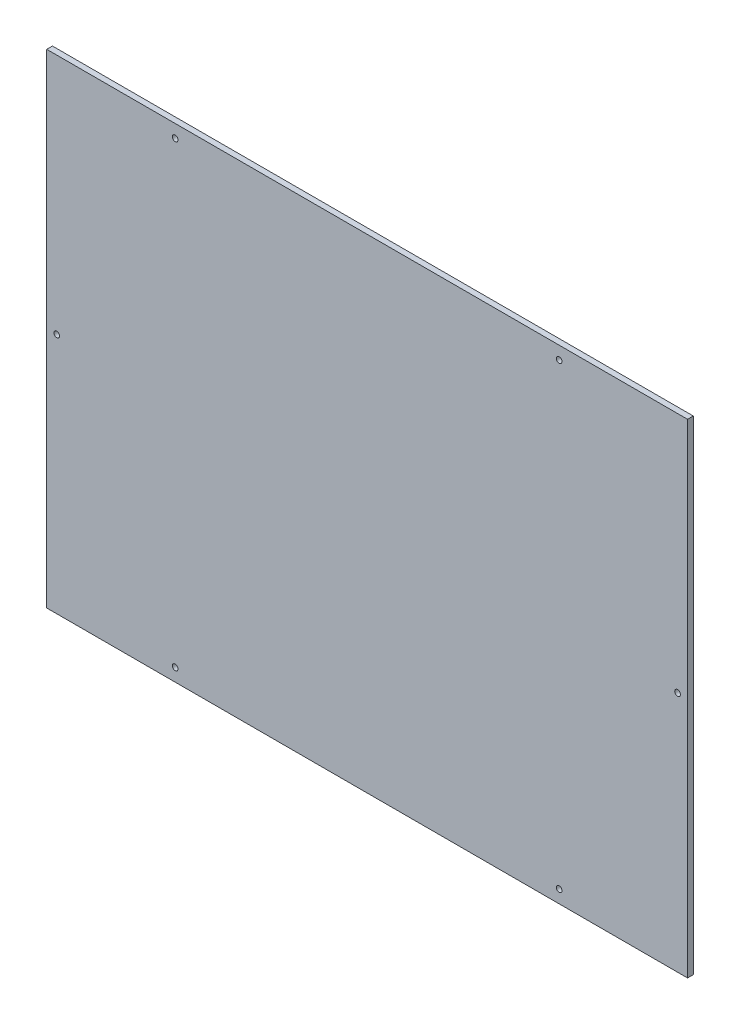
ISO-10303-21;
HEADER;
FILE_DESCRIPTION(('STEP AP214'),'2;1');
FILE_NAME('part.step','',(''),(''),'','','');
FILE_SCHEMA(('AUTOMOTIVE_DESIGN { 1 0 10303 214 1 1 1 1 }'));
ENDSEC;
DATA;
#1=APPLICATION_CONTEXT('core data for automotive mechanical design processes');
#2=APPLICATION_PROTOCOL_DEFINITION('international standard','automotive_design',2000,#1);
#3=PRODUCT_CONTEXT('',#1,'mechanical');
#4=PRODUCT('Part','Part','',(#3));
#5=PRODUCT_RELATED_PRODUCT_CATEGORY('part','',(#4));
#6=PRODUCT_DEFINITION_FORMATION('','',#4);
#7=PRODUCT_DEFINITION_CONTEXT('part definition',#1,'design');
#8=PRODUCT_DEFINITION('design','',#6,#7);
#9=PRODUCT_DEFINITION_SHAPE('','',#8);
#10=(LENGTH_UNIT() NAMED_UNIT(*) SI_UNIT(.MILLI.,.METRE.));
#11=(NAMED_UNIT(*) PLANE_ANGLE_UNIT() SI_UNIT($,.RADIAN.));
#12=(NAMED_UNIT(*) SI_UNIT($,.STERADIAN.) SOLID_ANGLE_UNIT());
#13=UNCERTAINTY_MEASURE_WITH_UNIT(LENGTH_MEASURE(1.E-05),#10,'distance_accuracy_value','');
#14=(GEOMETRIC_REPRESENTATION_CONTEXT(3) GLOBAL_UNCERTAINTY_ASSIGNED_CONTEXT((#13)) GLOBAL_UNIT_ASSIGNED_CONTEXT((#10,
#11,#12)) REPRESENTATION_CONTEXT('',''));
#15=CARTESIAN_POINT('',(0.,0.,0.));
#16=DIRECTION('',(0.,0.,1.));
#17=DIRECTION('',(1.,0.,0.));
#18=AXIS2_PLACEMENT_3D('',#15,#16,#17);
#19=CARTESIAN_POINT('',(0.,0.,4.));
#20=DIRECTION('',(0.,0.,1.));
#21=DIRECTION('',(1.,0.,0.));
#22=AXIS2_PLACEMENT_3D('',#19,#20,#21);
#23=PLANE('',#22);
#24=CARTESIAN_POINT('',(-359.,8.99999999999998,4.));
#25=DIRECTION('',(0.,0.,1.));
#26=DIRECTION('',(-1.,0.,0.));
#27=AXIS2_PLACEMENT_3D('',#24,#25,#26);
#28=CIRCLE('',#27,2.);
#29=CARTESIAN_POINT('',(-361.,8.99999999999998,4.));
#30=VERTEX_POINT('',#29);
#31=EDGE_CURVE('E135',#30,#30,#28,.T.);
#32=ORIENTED_EDGE('',*,*,#31,.F.);
#33=EDGE_LOOP('',(#32));
#34=FACE_BOUND('',#33,.T.);
#35=CARTESIAN_POINT('',(-7.,169.5,4.));
#36=DIRECTION('',(0.,0.,1.));
#37=DIRECTION('',(1.,0.,0.));
#38=AXIS2_PLACEMENT_3D('',#35,#36,#37);
#39=CIRCLE('',#38,2.);
#40=CARTESIAN_POINT('',(-5.,169.5,4.));
#41=VERTEX_POINT('',#40);
#42=EDGE_CURVE('E123',#41,#41,#39,.T.);
#43=ORIENTED_EDGE('',*,*,#42,.F.);
#44=EDGE_LOOP('',(#43));
#45=FACE_BOUND('',#44,.T.);
#46=CARTESIAN_POINT('',(-90.0000000000001,330.,4.));
#47=DIRECTION('',(0.,0.,1.));
#48=DIRECTION('',(-1.,0.,0.));
#49=AXIS2_PLACEMENT_3D('',#46,#47,#48);
#50=CIRCLE('',#49,2.);
#51=CARTESIAN_POINT('',(-92.0000000000001,330.,4.));
#52=VERTEX_POINT('',#51);
#53=EDGE_CURVE('E102',#52,#52,#50,.T.);
#54=ORIENTED_EDGE('',*,*,#53,.F.);
#55=EDGE_LOOP('',(#54));
#56=FACE_BOUND('',#55,.T.);
#57=DIRECTION('',(0.,1.,0.));
#58=VECTOR('',#57,1.);
#59=CARTESIAN_POINT('',(0.,0.,4.));
#60=LINE('',#59,#58);
#61=CARTESIAN_POINT('',(0.,0.,4.));
#62=VERTEX_POINT('',#61);
#63=CARTESIAN_POINT('',(-1.66533453693773E-13,339.,4.));
#64=VERTEX_POINT('',#63);
#65=EDGE_CURVE('E87',#62,#64,#60,.T.);
#66=ORIENTED_EDGE('',*,*,#65,.T.);
#67=DIRECTION('',(-1.,0.,0.));
#68=VECTOR('',#67,1.);
#69=CARTESIAN_POINT('',(-1.66533453693773E-13,339.,4.));
#70=LINE('',#69,#68);
#71=CARTESIAN_POINT('',(-449.,339.,4.));
#72=VERTEX_POINT('',#71);
#73=EDGE_CURVE('E82',#64,#72,#70,.T.);
#74=ORIENTED_EDGE('',*,*,#73,.T.);
#75=DIRECTION('',(0.,-1.,0.));
#76=VECTOR('',#75,1.);
#77=CARTESIAN_POINT('',(-449.,0.,4.));
#78=LINE('',#77,#76);
#79=CARTESIAN_POINT('',(-449.,0.,4.));
#80=VERTEX_POINT('',#79);
#81=EDGE_CURVE('E85',#72,#80,#78,.T.);
#82=ORIENTED_EDGE('',*,*,#81,.T.);
#83=DIRECTION('',(1.,0.,0.));
#84=VECTOR('',#83,1.);
#85=CARTESIAN_POINT('',(0.,0.,4.));
#86=LINE('',#85,#84);
#87=EDGE_CURVE('E52',#80,#62,#86,.T.);
#88=ORIENTED_EDGE('',*,*,#87,.T.);
#89=EDGE_LOOP('',(#66,#74,#82,#88));
#90=FACE_BOUND('',#89,.T.);
#91=CARTESIAN_POINT('',(-359.,330.,4.));
#92=DIRECTION('',(0.,0.,1.));
#93=DIRECTION('',(1.,0.,0.));
#94=AXIS2_PLACEMENT_3D('',#91,#92,#93);
#95=CIRCLE('',#94,2.);
#96=CARTESIAN_POINT('',(-357.,330.,4.));
#97=VERTEX_POINT('',#96);
#98=EDGE_CURVE('E117',#97,#97,#95,.T.);
#99=ORIENTED_EDGE('',*,*,#98,.F.);
#100=EDGE_LOOP('',(#99));
#101=FACE_BOUND('',#100,.T.);
#102=CARTESIAN_POINT('',(-442.,169.5,4.));
#103=DIRECTION('',(0.,0.,1.));
#104=DIRECTION('',(-1.,0.,0.));
#105=AXIS2_PLACEMENT_3D('',#102,#103,#104);
#106=CIRCLE('',#105,2.);
#107=CARTESIAN_POINT('',(-444.,169.5,4.));
#108=VERTEX_POINT('',#107);
#109=EDGE_CURVE('E129',#108,#108,#106,.T.);
#110=ORIENTED_EDGE('',*,*,#109,.F.);
#111=EDGE_LOOP('',(#110));
#112=FACE_BOUND('',#111,.T.);
#113=CARTESIAN_POINT('',(-90.0000000000001,9.00000000000001,4.));
#114=DIRECTION('',(0.,0.,1.));
#115=DIRECTION('',(1.,0.,0.));
#116=AXIS2_PLACEMENT_3D('',#113,#114,#115);
#117=CIRCLE('',#116,2.);
#118=CARTESIAN_POINT('',(-88.0000000000001,9.00000000000001,4.));
#119=VERTEX_POINT('',#118);
#120=EDGE_CURVE('E141',#119,#119,#117,.T.);
#121=ORIENTED_EDGE('',*,*,#120,.F.);
#122=EDGE_LOOP('',(#121));
#123=FACE_BOUND('',#122,.T.);
#124=ADVANCED_FACE('F35',(#34,#45,#56,#90,#101,#112,#123),#23,.T.);
#125=CARTESIAN_POINT('',(0.,0.,0.));
#126=DIRECTION('',(0.,0.,1.));
#127=DIRECTION('',(1.,0.,0.));
#128=AXIS2_PLACEMENT_3D('',#125,#126,#127);
#129=PLANE('',#128);
#130=CARTESIAN_POINT('',(-359.,8.99999999999998,0.));
#131=DIRECTION('',(0.,0.,1.));
#132=DIRECTION('',(-1.,0.,0.));
#133=AXIS2_PLACEMENT_3D('',#130,#131,#132);
#134=CIRCLE('',#133,2.);
#135=CARTESIAN_POINT('',(-361.,8.99999999999998,0.));
#136=VERTEX_POINT('',#135);
#137=EDGE_CURVE('E138',#136,#136,#134,.T.);
#138=ORIENTED_EDGE('',*,*,#137,.T.);
#139=EDGE_LOOP('',(#138));
#140=FACE_BOUND('',#139,.T.);
#141=CARTESIAN_POINT('',(-7.,169.5,0.));
#142=DIRECTION('',(0.,0.,1.));
#143=DIRECTION('',(1.,0.,0.));
#144=AXIS2_PLACEMENT_3D('',#141,#142,#143);
#145=CIRCLE('',#144,2.);
#146=CARTESIAN_POINT('',(-5.,169.5,0.));
#147=VERTEX_POINT('',#146);
#148=EDGE_CURVE('E126',#147,#147,#145,.T.);
#149=ORIENTED_EDGE('',*,*,#148,.T.);
#150=EDGE_LOOP('',(#149));
#151=FACE_BOUND('',#150,.T.);
#152=CARTESIAN_POINT('',(-90.0000000000001,330.,0.));
#153=DIRECTION('',(0.,0.,1.));
#154=DIRECTION('',(-1.,0.,0.));
#155=AXIS2_PLACEMENT_3D('',#152,#153,#154);
#156=CIRCLE('',#155,2.);
#157=CARTESIAN_POINT('',(-92.0000000000001,330.,0.));
#158=VERTEX_POINT('',#157);
#159=EDGE_CURVE('E114',#158,#158,#156,.T.);
#160=ORIENTED_EDGE('',*,*,#159,.T.);
#161=EDGE_LOOP('',(#160));
#162=FACE_BOUND('',#161,.T.);
#163=DIRECTION('',(0.,1.,0.));
#164=VECTOR('',#163,1.);
#165=CARTESIAN_POINT('',(0.,0.,0.));
#166=LINE('',#165,#164);
#167=CARTESIAN_POINT('',(0.,0.,0.));
#168=VERTEX_POINT('',#167);
#169=CARTESIAN_POINT('',(-1.66533453693773E-13,339.,0.));
#170=VERTEX_POINT('',#169);
#171=EDGE_CURVE('E99',#168,#170,#166,.T.);
#172=ORIENTED_EDGE('',*,*,#171,.F.);
#173=DIRECTION('',(1.,0.,0.));
#174=VECTOR('',#173,1.);
#175=CARTESIAN_POINT('',(0.,0.,0.));
#176=LINE('',#175,#174);
#177=CARTESIAN_POINT('',(-449.,0.,0.));
#178=VERTEX_POINT('',#177);
#179=EDGE_CURVE('E75',#178,#168,#176,.T.);
#180=ORIENTED_EDGE('',*,*,#179,.F.);
#181=DIRECTION('',(0.,-1.,0.));
#182=VECTOR('',#181,1.);
#183=CARTESIAN_POINT('',(-449.,0.,0.));
#184=LINE('',#183,#182);
#185=CARTESIAN_POINT('',(-449.,339.,0.));
#186=VERTEX_POINT('',#185);
#187=EDGE_CURVE('E69',#186,#178,#184,.T.);
#188=ORIENTED_EDGE('',*,*,#187,.F.);
#189=DIRECTION('',(-1.,0.,0.));
#190=VECTOR('',#189,1.);
#191=CARTESIAN_POINT('',(-1.66533453693773E-13,339.,0.));
#192=LINE('',#191,#190);
#193=EDGE_CURVE('E91',#170,#186,#192,.T.);
#194=ORIENTED_EDGE('',*,*,#193,.F.);
#195=EDGE_LOOP('',(#172,#180,#188,#194));
#196=FACE_BOUND('',#195,.T.);
#197=CARTESIAN_POINT('',(-359.,330.,0.));
#198=DIRECTION('',(0.,0.,1.));
#199=DIRECTION('',(1.,0.,0.));
#200=AXIS2_PLACEMENT_3D('',#197,#198,#199);
#201=CIRCLE('',#200,2.);
#202=CARTESIAN_POINT('',(-357.,330.,0.));
#203=VERTEX_POINT('',#202);
#204=EDGE_CURVE('E120',#203,#203,#201,.T.);
#205=ORIENTED_EDGE('',*,*,#204,.T.);
#206=EDGE_LOOP('',(#205));
#207=FACE_BOUND('',#206,.T.);
#208=CARTESIAN_POINT('',(-442.,169.5,0.));
#209=DIRECTION('',(0.,0.,1.));
#210=DIRECTION('',(-1.,0.,0.));
#211=AXIS2_PLACEMENT_3D('',#208,#209,#210);
#212=CIRCLE('',#211,2.);
#213=CARTESIAN_POINT('',(-444.,169.5,0.));
#214=VERTEX_POINT('',#213);
#215=EDGE_CURVE('E132',#214,#214,#212,.T.);
#216=ORIENTED_EDGE('',*,*,#215,.T.);
#217=EDGE_LOOP('',(#216));
#218=FACE_BOUND('',#217,.T.);
#219=CARTESIAN_POINT('',(-90.0000000000001,9.00000000000001,0.));
#220=DIRECTION('',(0.,0.,1.));
#221=DIRECTION('',(1.,0.,0.));
#222=AXIS2_PLACEMENT_3D('',#219,#220,#221);
#223=CIRCLE('',#222,2.);
#224=CARTESIAN_POINT('',(-88.0000000000001,9.00000000000001,0.));
#225=VERTEX_POINT('',#224);
#226=EDGE_CURVE('E144',#225,#225,#223,.T.);
#227=ORIENTED_EDGE('',*,*,#226,.T.);
#228=EDGE_LOOP('',(#227));
#229=FACE_BOUND('',#228,.T.);
#230=ADVANCED_FACE('F110',(#140,#151,#162,#196,#207,#218,#229),#129,.F.);
#231=CARTESIAN_POINT('',(0.,0.,4.));
#232=DIRECTION('',(-1.,0.,0.));
#233=DIRECTION('',(0.,-1.,0.));
#234=AXIS2_PLACEMENT_3D('',#231,#232,#233);
#235=PLANE('',#234);
#236=ORIENTED_EDGE('',*,*,#171,.T.);
#237=DIRECTION('',(0.,0.,-1.));
#238=VECTOR('',#237,1.);
#239=CARTESIAN_POINT('',(-1.66533453693773E-13,339.,4.));
#240=LINE('',#239,#238);
#241=EDGE_CURVE('E11',#64,#170,#240,.T.);
#242=ORIENTED_EDGE('',*,*,#241,.F.);
#243=ORIENTED_EDGE('',*,*,#65,.F.);
#244=DIRECTION('',(0.,0.,-1.));
#245=VECTOR('',#244,1.);
#246=CARTESIAN_POINT('',(0.,0.,4.));
#247=LINE('',#246,#245);
#248=EDGE_CURVE('E95',#62,#168,#247,.T.);
#249=ORIENTED_EDGE('',*,*,#248,.T.);
#250=EDGE_LOOP('',(#236,#242,#243,#249));
#251=FACE_BOUND('',#250,.T.);
#252=ADVANCED_FACE('F37',(#251),#235,.F.);
#253=CARTESIAN_POINT('',(-1.66533453693773E-13,339.,4.));
#254=DIRECTION('',(0.,-1.,0.));
#255=DIRECTION('',(1.,0.,0.));
#256=AXIS2_PLACEMENT_3D('',#253,#254,#255);
#257=PLANE('',#256);
#258=ORIENTED_EDGE('',*,*,#193,.T.);
#259=DIRECTION('',(0.,0.,-1.));
#260=VECTOR('',#259,1.);
#261=CARTESIAN_POINT('',(-449.,339.,4.));
#262=LINE('',#261,#260);
#263=EDGE_CURVE('E44',#72,#186,#262,.T.);
#264=ORIENTED_EDGE('',*,*,#263,.F.);
#265=ORIENTED_EDGE('',*,*,#73,.F.);
#266=ORIENTED_EDGE('',*,*,#241,.T.);
#267=EDGE_LOOP('',(#258,#264,#265,#266));
#268=FACE_BOUND('',#267,.T.);
#269=ADVANCED_FACE('F90',(#268),#257,.F.);
#270=CARTESIAN_POINT('',(-449.,0.,4.));
#271=DIRECTION('',(1.,0.,0.));
#272=DIRECTION('',(0.,1.,0.));
#273=AXIS2_PLACEMENT_3D('',#270,#271,#272);
#274=PLANE('',#273);
#275=ORIENTED_EDGE('',*,*,#187,.T.);
#276=DIRECTION('',(0.,0.,-1.));
#277=VECTOR('',#276,1.);
#278=CARTESIAN_POINT('',(-449.,0.,4.));
#279=LINE('',#278,#277);
#280=EDGE_CURVE('E92',#80,#178,#279,.T.);
#281=ORIENTED_EDGE('',*,*,#280,.F.);
#282=ORIENTED_EDGE('',*,*,#81,.F.);
#283=ORIENTED_EDGE('',*,*,#263,.T.);
#284=EDGE_LOOP('',(#275,#281,#282,#283));
#285=FACE_BOUND('',#284,.T.);
#286=ADVANCED_FACE('F93',(#285),#274,.F.);
#287=CARTESIAN_POINT('',(0.,0.,4.));
#288=DIRECTION('',(0.,1.,0.));
#289=DIRECTION('',(-1.,0.,0.));
#290=AXIS2_PLACEMENT_3D('',#287,#288,#289);
#291=PLANE('',#290);
#292=ORIENTED_EDGE('',*,*,#179,.T.);
#293=ORIENTED_EDGE('',*,*,#248,.F.);
#294=ORIENTED_EDGE('',*,*,#87,.F.);
#295=ORIENTED_EDGE('',*,*,#280,.T.);
#296=EDGE_LOOP('',(#292,#293,#294,#295));
#297=FACE_BOUND('',#296,.T.);
#298=ADVANCED_FACE('F107',(#297),#291,.F.);
#299=CARTESIAN_POINT('',(-90.0000000000001,330.,4.));
#300=DIRECTION('',(0.,0.,-1.));
#301=DIRECTION('',(-1.,0.,0.));
#302=AXIS2_PLACEMENT_3D('',#299,#300,#301);
#303=CYLINDRICAL_SURFACE('',#302,2.);
#304=ORIENTED_EDGE('',*,*,#53,.T.);
#305=EDGE_LOOP('',(#304));
#306=FACE_BOUND('',#305,.T.);
#307=ORIENTED_EDGE('',*,*,#159,.F.);
#308=EDGE_LOOP('',(#307));
#309=FACE_BOUND('',#308,.T.);
#310=ADVANCED_FACE('F164',(#306,#309),#303,.F.);
#311=CARTESIAN_POINT('',(-359.,330.,4.));
#312=DIRECTION('',(0.,0.,-1.));
#313=DIRECTION('',(-1.,0.,0.));
#314=AXIS2_PLACEMENT_3D('',#311,#312,#313);
#315=CYLINDRICAL_SURFACE('',#314,2.);
#316=ORIENTED_EDGE('',*,*,#98,.T.);
#317=EDGE_LOOP('',(#316));
#318=FACE_BOUND('',#317,.T.);
#319=ORIENTED_EDGE('',*,*,#204,.F.);
#320=EDGE_LOOP('',(#319));
#321=FACE_BOUND('',#320,.T.);
#322=ADVANCED_FACE('F212',(#318,#321),#315,.F.);
#323=CARTESIAN_POINT('',(-7.,169.5,4.));
#324=DIRECTION('',(0.,0.,-1.));
#325=DIRECTION('',(-1.,0.,0.));
#326=AXIS2_PLACEMENT_3D('',#323,#324,#325);
#327=CYLINDRICAL_SURFACE('',#326,2.);
#328=ORIENTED_EDGE('',*,*,#42,.T.);
#329=EDGE_LOOP('',(#328));
#330=FACE_BOUND('',#329,.T.);
#331=ORIENTED_EDGE('',*,*,#148,.F.);
#332=EDGE_LOOP('',(#331));
#333=FACE_BOUND('',#332,.T.);
#334=ADVANCED_FACE('F220',(#330,#333),#327,.F.);
#335=CARTESIAN_POINT('',(-442.,169.5,4.));
#336=DIRECTION('',(0.,0.,-1.));
#337=DIRECTION('',(-1.,0.,0.));
#338=AXIS2_PLACEMENT_3D('',#335,#336,#337);
#339=CYLINDRICAL_SURFACE('',#338,2.);
#340=ORIENTED_EDGE('',*,*,#109,.T.);
#341=EDGE_LOOP('',(#340));
#342=FACE_BOUND('',#341,.T.);
#343=ORIENTED_EDGE('',*,*,#215,.F.);
#344=EDGE_LOOP('',(#343));
#345=FACE_BOUND('',#344,.T.);
#346=ADVANCED_FACE('F228',(#342,#345),#339,.F.);
#347=CARTESIAN_POINT('',(-359.,8.99999999999998,4.));
#348=DIRECTION('',(0.,0.,-1.));
#349=DIRECTION('',(-1.,0.,0.));
#350=AXIS2_PLACEMENT_3D('',#347,#348,#349);
#351=CYLINDRICAL_SURFACE('',#350,2.);
#352=ORIENTED_EDGE('',*,*,#31,.T.);
#353=EDGE_LOOP('',(#352));
#354=FACE_BOUND('',#353,.T.);
#355=ORIENTED_EDGE('',*,*,#137,.F.);
#356=EDGE_LOOP('',(#355));
#357=FACE_BOUND('',#356,.T.);
#358=ADVANCED_FACE('F237',(#354,#357),#351,.F.);
#359=CARTESIAN_POINT('',(-90.0000000000001,9.00000000000001,4.));
#360=DIRECTION('',(0.,0.,-1.));
#361=DIRECTION('',(-1.,0.,0.));
#362=AXIS2_PLACEMENT_3D('',#359,#360,#361);
#363=CYLINDRICAL_SURFACE('',#362,2.);
#364=ORIENTED_EDGE('',*,*,#120,.T.);
#365=EDGE_LOOP('',(#364));
#366=FACE_BOUND('',#365,.T.);
#367=ORIENTED_EDGE('',*,*,#226,.F.);
#368=EDGE_LOOP('',(#367));
#369=FACE_BOUND('',#368,.T.);
#370=ADVANCED_FACE('F150',(#366,#369),#363,.F.);
#371=CLOSED_SHELL('',(#124,#230,#252,#269,#286,#298,#310,#322,#334,#346,#358,#370));
#372=MANIFOLD_SOLID_BREP('B2',#371);
#373=ADVANCED_BREP_SHAPE_REPRESENTATION('',(#18,#372),#14);
#374=SHAPE_DEFINITION_REPRESENTATION(#9,#373);
ENDSEC;
END-ISO-10303-21;
